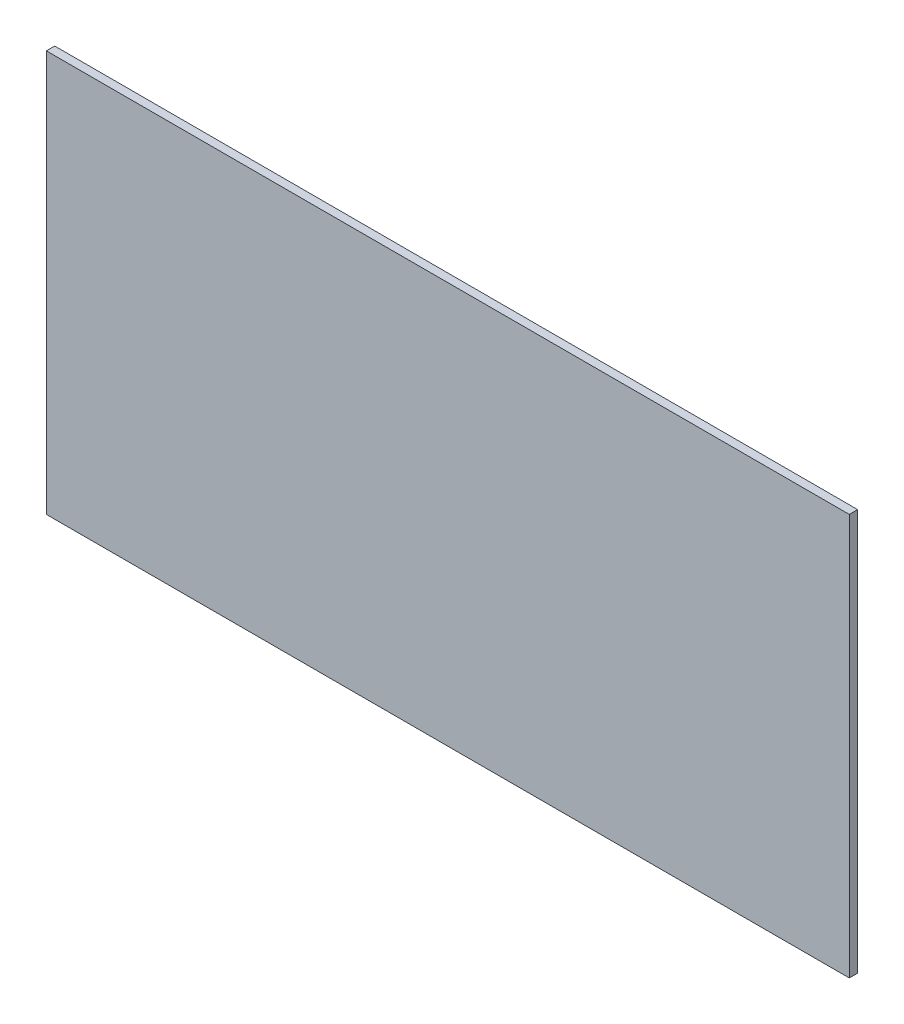
ISO-10303-21;
HEADER;
FILE_DESCRIPTION(('STEP AP214'),'2;1');
FILE_NAME('part.step','',(''),(''),'','','');
FILE_SCHEMA(('AUTOMOTIVE_DESIGN { 1 0 10303 214 1 1 1 1 }'));
ENDSEC;
DATA;
#1=APPLICATION_CONTEXT('core data for automotive mechanical design processes');
#2=APPLICATION_PROTOCOL_DEFINITION('international standard','automotive_design',2000,#1);
#3=PRODUCT_CONTEXT('',#1,'mechanical');
#4=PRODUCT('Part','Part','',(#3));
#5=PRODUCT_RELATED_PRODUCT_CATEGORY('part','',(#4));
#6=PRODUCT_DEFINITION_FORMATION('','',#4);
#7=PRODUCT_DEFINITION_CONTEXT('part definition',#1,'design');
#8=PRODUCT_DEFINITION('design','',#6,#7);
#9=PRODUCT_DEFINITION_SHAPE('','',#8);
#10=(LENGTH_UNIT() NAMED_UNIT(*) SI_UNIT(.MILLI.,.METRE.));
#11=(NAMED_UNIT(*) PLANE_ANGLE_UNIT() SI_UNIT($,.RADIAN.));
#12=(NAMED_UNIT(*) SI_UNIT($,.STERADIAN.) SOLID_ANGLE_UNIT());
#13=UNCERTAINTY_MEASURE_WITH_UNIT(LENGTH_MEASURE(1.E-05),#10,'distance_accuracy_value','');
#14=(GEOMETRIC_REPRESENTATION_CONTEXT(3) GLOBAL_UNCERTAINTY_ASSIGNED_CONTEXT((#13)) GLOBAL_UNIT_ASSIGNED_CONTEXT((#10,
#11,#12)) REPRESENTATION_CONTEXT('',''));
#15=CARTESIAN_POINT('',(0.,0.,0.));
#16=DIRECTION('',(0.,0.,1.));
#17=DIRECTION('',(1.,0.,0.));
#18=AXIS2_PLACEMENT_3D('',#15,#16,#17);
#19=CARTESIAN_POINT('',(-287.401909307876,176.436038186158,6.35));
#20=DIRECTION('',(1.,0.,0.));
#21=DIRECTION('',(0.,0.,-1.));
#22=AXIS2_PLACEMENT_3D('',#19,#20,#21);
#23=PLANE('',#22);
#24=DIRECTION('',(0.,-1.,0.));
#25=VECTOR('',#24,1.);
#26=CARTESIAN_POINT('',(-287.401909307876,176.436038186158,0.));
#27=LINE('',#26,#25);
#28=CARTESIAN_POINT('',(-287.401909307876,176.436038186158,0.));
#29=VERTEX_POINT('',#28);
#30=CARTESIAN_POINT('',(-287.401909307876,-128.363961813842,0.));
#31=VERTEX_POINT('',#30);
#32=EDGE_CURVE('E96',#29,#31,#27,.T.);
#33=ORIENTED_EDGE('',*,*,#32,.T.);
#34=DIRECTION('',(0.,0.,-1.));
#35=VECTOR('',#34,1.);
#36=CARTESIAN_POINT('',(-287.401909307876,-128.363961813842,6.35));
#37=LINE('',#36,#35);
#38=CARTESIAN_POINT('',(-287.401909307876,-128.363961813842,6.35));
#39=VERTEX_POINT('',#38);
#40=EDGE_CURVE('E11',#39,#31,#37,.T.);
#41=ORIENTED_EDGE('',*,*,#40,.F.);
#42=DIRECTION('',(0.,-1.,0.));
#43=VECTOR('',#42,1.);
#44=CARTESIAN_POINT('',(-287.401909307876,176.436038186158,6.35));
#45=LINE('',#44,#43);
#46=CARTESIAN_POINT('',(-287.401909307876,176.436038186158,6.35));
#47=VERTEX_POINT('',#46);
#48=EDGE_CURVE('E84',#47,#39,#45,.T.);
#49=ORIENTED_EDGE('',*,*,#48,.F.);
#50=DIRECTION('',(0.,0.,-1.));
#51=VECTOR('',#50,1.);
#52=CARTESIAN_POINT('',(-287.401909307876,176.436038186158,6.35));
#53=LINE('',#52,#51);
#54=EDGE_CURVE('E92',#47,#29,#53,.T.);
#55=ORIENTED_EDGE('',*,*,#54,.T.);
#56=EDGE_LOOP('',(#33,#41,#49,#55));
#57=FACE_BOUND('',#56,.T.);
#58=ADVANCED_FACE('F33',(#57),#23,.F.);
#59=CARTESIAN_POINT('',(-287.401909307876,-128.363961813842,6.35));
#60=DIRECTION('',(0.,1.,0.));
#61=DIRECTION('',(0.,0.,1.));
#62=AXIS2_PLACEMENT_3D('',#59,#60,#61);
#63=PLANE('',#62);
#64=DIRECTION('',(1.,0.,0.));
#65=VECTOR('',#64,1.);
#66=CARTESIAN_POINT('',(-287.401909307876,-128.363961813842,0.));
#67=LINE('',#66,#65);
#68=CARTESIAN_POINT('',(322.198090692124,-128.363961813842,0.));
#69=VERTEX_POINT('',#68);
#70=EDGE_CURVE('E88',#31,#69,#67,.T.);
#71=ORIENTED_EDGE('',*,*,#70,.T.);
#72=DIRECTION('',(0.,0.,-1.));
#73=VECTOR('',#72,1.);
#74=CARTESIAN_POINT('',(322.198090692124,-128.363961813842,6.35));
#75=LINE('',#74,#73);
#76=CARTESIAN_POINT('',(322.198090692124,-128.363961813842,6.35));
#77=VERTEX_POINT('',#76);
#78=EDGE_CURVE('E41',#77,#69,#75,.T.);
#79=ORIENTED_EDGE('',*,*,#78,.F.);
#80=DIRECTION('',(1.,0.,0.));
#81=VECTOR('',#80,1.);
#82=CARTESIAN_POINT('',(-287.401909307876,-128.363961813842,6.35));
#83=LINE('',#82,#81);
#84=EDGE_CURVE('E79',#39,#77,#83,.T.);
#85=ORIENTED_EDGE('',*,*,#84,.F.);
#86=ORIENTED_EDGE('',*,*,#40,.T.);
#87=EDGE_LOOP('',(#71,#79,#85,#86));
#88=FACE_BOUND('',#87,.T.);
#89=ADVANCED_FACE('F87',(#88),#63,.F.);
#90=CARTESIAN_POINT('',(322.198090692124,176.436038186158,6.35));
#91=DIRECTION('',(-1.,0.,0.));
#92=DIRECTION('',(0.,0.,1.));
#93=AXIS2_PLACEMENT_3D('',#90,#91,#92);
#94=PLANE('',#93);
#95=DIRECTION('',(0.,1.,0.));
#96=VECTOR('',#95,1.);
#97=CARTESIAN_POINT('',(322.198090692124,176.436038186158,0.));
#98=LINE('',#97,#96);
#99=CARTESIAN_POINT('',(322.198090692124,176.436038186158,0.));
#100=VERTEX_POINT('',#99);
#101=EDGE_CURVE('E66',#69,#100,#98,.T.);
#102=ORIENTED_EDGE('',*,*,#101,.T.);
#103=DIRECTION('',(0.,0.,-1.));
#104=VECTOR('',#103,1.);
#105=CARTESIAN_POINT('',(322.198090692124,176.436038186158,6.35));
#106=LINE('',#105,#104);
#107=CARTESIAN_POINT('',(322.198090692124,176.436038186158,6.35));
#108=VERTEX_POINT('',#107);
#109=EDGE_CURVE('E89',#108,#100,#106,.T.);
#110=ORIENTED_EDGE('',*,*,#109,.F.);
#111=DIRECTION('',(0.,1.,0.));
#112=VECTOR('',#111,1.);
#113=CARTESIAN_POINT('',(322.198090692124,176.436038186158,6.35));
#114=LINE('',#113,#112);
#115=EDGE_CURVE('E82',#77,#108,#114,.T.);
#116=ORIENTED_EDGE('',*,*,#115,.F.);
#117=ORIENTED_EDGE('',*,*,#78,.T.);
#118=EDGE_LOOP('',(#102,#110,#116,#117));
#119=FACE_BOUND('',#118,.T.);
#120=ADVANCED_FACE('F90',(#119),#94,.F.);
#121=CARTESIAN_POINT('',(-287.401909307876,176.436038186158,6.35));
#122=DIRECTION('',(0.,-1.,0.));
#123=DIRECTION('',(0.,0.,-1.));
#124=AXIS2_PLACEMENT_3D('',#121,#122,#123);
#125=PLANE('',#124);
#126=DIRECTION('',(-1.,0.,0.));
#127=VECTOR('',#126,1.);
#128=CARTESIAN_POINT('',(-287.401909307876,176.436038186158,0.));
#129=LINE('',#128,#127);
#130=EDGE_CURVE('E72',#100,#29,#129,.T.);
#131=ORIENTED_EDGE('',*,*,#130,.T.);
#132=ORIENTED_EDGE('',*,*,#54,.F.);
#133=DIRECTION('',(-1.,0.,0.));
#134=VECTOR('',#133,1.);
#135=CARTESIAN_POINT('',(-287.401909307876,176.436038186158,6.35));
#136=LINE('',#135,#134);
#137=EDGE_CURVE('E49',#108,#47,#136,.T.);
#138=ORIENTED_EDGE('',*,*,#137,.F.);
#139=ORIENTED_EDGE('',*,*,#109,.T.);
#140=EDGE_LOOP('',(#131,#132,#138,#139));
#141=FACE_BOUND('',#140,.T.);
#142=ADVANCED_FACE('F103',(#141),#125,.F.);
#143=CARTESIAN_POINT('',(0.,0.,6.35));
#144=DIRECTION('',(0.,0.,1.));
#145=DIRECTION('',(1.,0.,0.));
#146=AXIS2_PLACEMENT_3D('',#143,#144,#145);
#147=PLANE('',#146);
#148=ORIENTED_EDGE('',*,*,#48,.T.);
#149=ORIENTED_EDGE('',*,*,#84,.T.);
#150=ORIENTED_EDGE('',*,*,#115,.T.);
#151=ORIENTED_EDGE('',*,*,#137,.T.);
#152=EDGE_LOOP('',(#148,#149,#150,#151));
#153=FACE_BOUND('',#152,.T.);
#154=ADVANCED_FACE('F80',(#153),#147,.T.);
#155=CARTESIAN_POINT('',(0.,0.,0.));
#156=DIRECTION('',(0.,0.,1.));
#157=DIRECTION('',(1.,0.,0.));
#158=AXIS2_PLACEMENT_3D('',#155,#156,#157);
#159=PLANE('',#158);
#160=ORIENTED_EDGE('',*,*,#32,.F.);
#161=ORIENTED_EDGE('',*,*,#130,.F.);
#162=ORIENTED_EDGE('',*,*,#101,.F.);
#163=ORIENTED_EDGE('',*,*,#70,.F.);
#164=EDGE_LOOP('',(#160,#161,#162,#163));
#165=FACE_BOUND('',#164,.T.);
#166=ADVANCED_FACE('F106',(#165),#159,.F.);
#167=CLOSED_SHELL('',(#58,#89,#120,#142,#154,#166));
#168=MANIFOLD_SOLID_BREP('B2',#167);
#169=ADVANCED_BREP_SHAPE_REPRESENTATION('',(#18,#168),#14);
#170=SHAPE_DEFINITION_REPRESENTATION(#9,#169);
ENDSEC;
END-ISO-10303-21;
